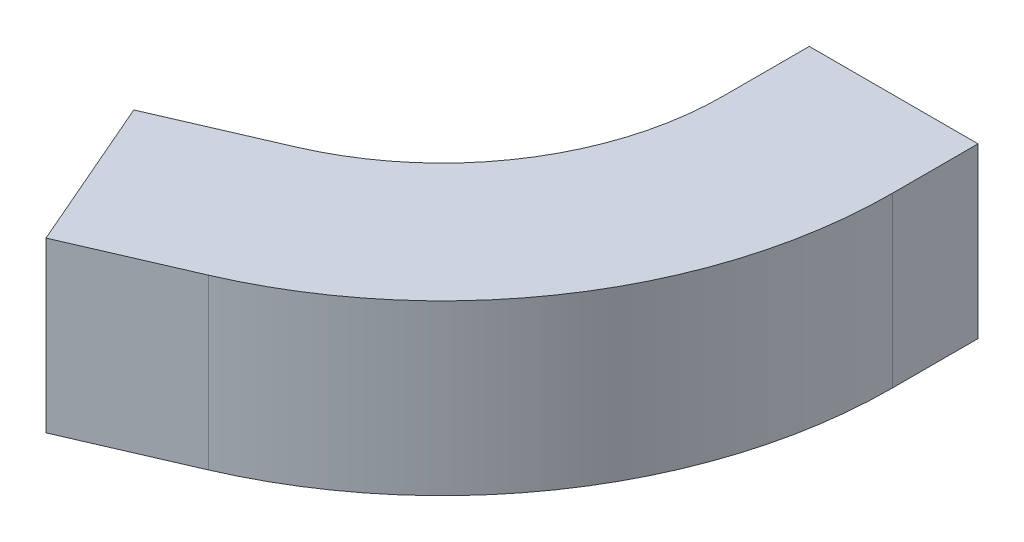
ISO-10303-21;
HEADER;
FILE_DESCRIPTION(('STEP AP214'),'2;1');
FILE_NAME('part.step','',(''),(''),'','','');
FILE_SCHEMA(('AUTOMOTIVE_DESIGN { 1 0 10303 214 1 1 1 1 }'));
ENDSEC;
DATA;
#1=APPLICATION_CONTEXT('core data for automotive mechanical design processes');
#2=APPLICATION_PROTOCOL_DEFINITION('international standard','automotive_design',2000,#1);
#3=PRODUCT_CONTEXT('',#1,'mechanical');
#4=PRODUCT('Part','Part','',(#3));
#5=PRODUCT_RELATED_PRODUCT_CATEGORY('part','',(#4));
#6=PRODUCT_DEFINITION_FORMATION('','',#4);
#7=PRODUCT_DEFINITION_CONTEXT('part definition',#1,'design');
#8=PRODUCT_DEFINITION('design','',#6,#7);
#9=PRODUCT_DEFINITION_SHAPE('','',#8);
#10=(LENGTH_UNIT() NAMED_UNIT(*) SI_UNIT(.MILLI.,.METRE.));
#11=(NAMED_UNIT(*) PLANE_ANGLE_UNIT() SI_UNIT($,.RADIAN.));
#12=(NAMED_UNIT(*) SI_UNIT($,.STERADIAN.) SOLID_ANGLE_UNIT());
#13=UNCERTAINTY_MEASURE_WITH_UNIT(LENGTH_MEASURE(1.E-05),#10,'distance_accuracy_value','');
#14=(GEOMETRIC_REPRESENTATION_CONTEXT(3) GLOBAL_UNCERTAINTY_ASSIGNED_CONTEXT((#13)) GLOBAL_UNIT_ASSIGNED_CONTEXT((#10,
#11,#12)) REPRESENTATION_CONTEXT('',''));
#15=CARTESIAN_POINT('',(0.,0.,0.));
#16=DIRECTION('',(0.,0.,1.));
#17=DIRECTION('',(1.,0.,0.));
#18=AXIS2_PLACEMENT_3D('',#15,#16,#17);
#19=CARTESIAN_POINT('',(-10.0670077006638,15.,4.35846945093989));
#20=DIRECTION('',(-0.917685296323042,0.,0.397308062984493));
#21=DIRECTION('',(0.397308062984493,0.,0.917685296323043));
#22=AXIS2_PLACEMENT_3D('',#19,#20,#21);
#23=PLANE('',#22);
#24=DIRECTION('',(-0.397308062984493,0.,-0.917685296323043));
#25=VECTOR('',#24,1.);
#26=CARTESIAN_POINT('',(-10.0670077006638,0.,4.35846945093989));
#27=LINE('',#26,#25);
#28=CARTESIAN_POINT('',(5.82531481871593,0.,41.0658813038616));
#29=VERTEX_POINT('',#28);
#30=CARTESIAN_POINT('',(-0.134306126051469,0.,27.300601859016));
#31=VERTEX_POINT('',#30);
#32=EDGE_CURVE('E142',#29,#31,#27,.T.);
#33=ORIENTED_EDGE('',*,*,#32,.F.);
#34=DIRECTION('',(0.,-1.,0.));
#35=VECTOR('',#34,1.);
#36=CARTESIAN_POINT('',(5.82531481871593,15.,41.0658813038616));
#37=LINE('',#36,#35);
#38=CARTESIAN_POINT('',(5.82531481871593,15.,41.0658813038616));
#39=VERTEX_POINT('',#38);
#40=EDGE_CURVE('E11',#39,#29,#37,.T.);
#41=ORIENTED_EDGE('',*,*,#40,.F.);
#42=DIRECTION('',(-0.397308062984493,0.,-0.917685296323043));
#43=VECTOR('',#42,1.);
#44=CARTESIAN_POINT('',(-10.0670077006638,15.,4.35846945093989));
#45=LINE('',#44,#43);
#46=CARTESIAN_POINT('',(-0.134306126051469,15.,27.300601859016));
#47=VERTEX_POINT('',#46);
#48=EDGE_CURVE('E169',#39,#47,#45,.T.);
#49=ORIENTED_EDGE('',*,*,#48,.T.);
#50=DIRECTION('',(0.,-1.,0.));
#51=VECTOR('',#50,1.);
#52=CARTESIAN_POINT('',(-0.134306126051469,15.,27.300601859016));
#53=LINE('',#52,#51);
#54=EDGE_CURVE('E62',#47,#31,#53,.T.);
#55=ORIENTED_EDGE('',*,*,#54,.T.);
#56=EDGE_LOOP('',(#33,#41,#49,#55));
#57=FACE_BOUND('',#56,.T.);
#58=ADVANCED_FACE('F45',(#57),#23,.T.);
#59=CARTESIAN_POINT('',(15.8923225193797,15.,36.7074118529217));
#60=DIRECTION('',(0.397308062984493,0.,0.917685296323042));
#61=DIRECTION('',(0.917685296323043,0.,-0.397308062984493));
#62=AXIS2_PLACEMENT_3D('',#59,#60,#61);
#63=PLANE('',#62);
#64=DIRECTION('',(-0.917685296323043,0.,0.397308062984493));
#65=VECTOR('',#64,1.);
#66=CARTESIAN_POINT('',(15.8923225193797,0.,36.7074118529217));
#67=LINE('',#66,#65);
#68=CARTESIAN_POINT('',(15.8923225193797,0.,36.7074118529217));
#69=VERTEX_POINT('',#68);
#70=EDGE_CURVE('E145',#69,#29,#67,.T.);
#71=ORIENTED_EDGE('',*,*,#70,.F.);
#72=DIRECTION('',(0.,-1.,0.));
#73=VECTOR('',#72,1.);
#74=CARTESIAN_POINT('',(15.8923225193797,15.,36.7074118529217));
#75=LINE('',#74,#73);
#76=CARTESIAN_POINT('',(15.8923225193797,15.,36.7074118529217));
#77=VERTEX_POINT('',#76);
#78=EDGE_CURVE('E54',#77,#69,#75,.T.);
#79=ORIENTED_EDGE('',*,*,#78,.F.);
#80=DIRECTION('',(-0.917685296323043,0.,0.397308062984493));
#81=VECTOR('',#80,1.);
#82=CARTESIAN_POINT('',(15.8923225193797,15.,36.7074118529217));
#83=LINE('',#82,#81);
#84=EDGE_CURVE('E197',#77,#39,#83,.T.);
#85=ORIENTED_EDGE('',*,*,#84,.T.);
#86=ORIENTED_EDGE('',*,*,#40,.T.);
#87=EDGE_LOOP('',(#71,#79,#85,#86));
#88=FACE_BOUND('',#87,.T.);
#89=ADVANCED_FACE('F196',(#88),#63,.T.);
#90=CARTESIAN_POINT('',(0.,15.,0.));
#91=DIRECTION('',(0.,-1.,0.));
#92=DIRECTION('',(0.,0.,-1.));
#93=AXIS2_PLACEMENT_3D('',#90,#91,#92);
#94=CYLINDRICAL_SURFACE('',#93,40.);
#95=CARTESIAN_POINT('',(0.,0.,0.));
#96=DIRECTION('',(0.,1.,0.));
#97=DIRECTION('',(0.,0.,1.));
#98=AXIS2_PLACEMENT_3D('',#95,#96,#97);
#99=CIRCLE('',#98,40.);
#100=CARTESIAN_POINT('',(40.,0.,0.));
#101=VERTEX_POINT('',#100);
#102=EDGE_CURVE('E149',#69,#101,#99,.T.);
#103=ORIENTED_EDGE('',*,*,#102,.T.);
#104=DIRECTION('',(0.,-1.,0.));
#105=VECTOR('',#104,1.);
#106=CARTESIAN_POINT('',(40.,15.,0.));
#107=LINE('',#106,#105);
#108=CARTESIAN_POINT('',(40.,15.,0.));
#109=VERTEX_POINT('',#108);
#110=EDGE_CURVE('E179',#109,#101,#107,.T.);
#111=ORIENTED_EDGE('',*,*,#110,.F.);
#112=CARTESIAN_POINT('',(0.,15.,0.));
#113=DIRECTION('',(0.,1.,0.));
#114=DIRECTION('',(0.,0.,1.));
#115=AXIS2_PLACEMENT_3D('',#112,#113,#114);
#116=CIRCLE('',#115,40.);
#117=EDGE_CURVE('E188',#77,#109,#116,.T.);
#118=ORIENTED_EDGE('',*,*,#117,.F.);
#119=ORIENTED_EDGE('',*,*,#78,.T.);
#120=EDGE_LOOP('',(#103,#111,#118,#119));
#121=FACE_BOUND('',#120,.T.);
#122=ADVANCED_FACE('F186',(#121),#94,.T.);
#123=CARTESIAN_POINT('',(40.,15.,0.));
#124=DIRECTION('',(-1.,0.,0.));
#125=DIRECTION('',(0.,0.,1.));
#126=AXIS2_PLACEMENT_3D('',#123,#124,#125);
#127=PLANE('',#126);
#128=DIRECTION('',(0.,0.,-1.));
#129=VECTOR('',#128,1.);
#130=CARTESIAN_POINT('',(40.,0.,0.));
#131=LINE('',#130,#129);
#132=CARTESIAN_POINT('',(40.,0.,-7.62));
#133=VERTEX_POINT('',#132);
#134=EDGE_CURVE('E152',#101,#133,#131,.T.);
#135=ORIENTED_EDGE('',*,*,#134,.T.);
#136=DIRECTION('',(0.,-1.,0.));
#137=VECTOR('',#136,1.);
#138=CARTESIAN_POINT('',(40.,15.,-7.62));
#139=LINE('',#138,#137);
#140=CARTESIAN_POINT('',(40.,15.,-7.62));
#141=VERTEX_POINT('',#140);
#142=EDGE_CURVE('E176',#141,#133,#139,.T.);
#143=ORIENTED_EDGE('',*,*,#142,.F.);
#144=DIRECTION('',(0.,0.,-1.));
#145=VECTOR('',#144,1.);
#146=CARTESIAN_POINT('',(40.,15.,0.));
#147=LINE('',#146,#145);
#148=EDGE_CURVE('E328',#109,#141,#147,.T.);
#149=ORIENTED_EDGE('',*,*,#148,.F.);
#150=ORIENTED_EDGE('',*,*,#110,.T.);
#151=EDGE_LOOP('',(#135,#143,#149,#150));
#152=FACE_BOUND('',#151,.T.);
#153=ADVANCED_FACE('F215',(#152),#127,.F.);
#154=CARTESIAN_POINT('',(0.,15.,-7.62));
#155=DIRECTION('',(0.,0.,-1.));
#156=DIRECTION('',(-1.,0.,0.));
#157=AXIS2_PLACEMENT_3D('',#154,#155,#156);
#158=PLANE('',#157);
#159=DIRECTION('',(1.,0.,0.));
#160=VECTOR('',#159,1.);
#161=CARTESIAN_POINT('',(0.,0.,-7.62));
#162=LINE('',#161,#160);
#163=CARTESIAN_POINT('',(25.,0.,-7.62));
#164=VERTEX_POINT('',#163);
#165=EDGE_CURVE('E156',#164,#133,#162,.T.);
#166=ORIENTED_EDGE('',*,*,#165,.F.);
#167=DIRECTION('',(0.,-1.,0.));
#168=VECTOR('',#167,1.);
#169=CARTESIAN_POINT('',(25.,15.,-7.62));
#170=LINE('',#169,#168);
#171=CARTESIAN_POINT('',(25.,15.,-7.62));
#172=VERTEX_POINT('',#171);
#173=EDGE_CURVE('E122',#172,#164,#170,.T.);
#174=ORIENTED_EDGE('',*,*,#173,.F.);
#175=DIRECTION('',(1.,0.,0.));
#176=VECTOR('',#175,1.);
#177=CARTESIAN_POINT('',(0.,15.,-7.62));
#178=LINE('',#177,#176);
#179=EDGE_CURVE('E131',#172,#141,#178,.T.);
#180=ORIENTED_EDGE('',*,*,#179,.T.);
#181=ORIENTED_EDGE('',*,*,#142,.T.);
#182=EDGE_LOOP('',(#166,#174,#180,#181));
#183=FACE_BOUND('',#182,.T.);
#184=ADVANCED_FACE('F220',(#183),#158,.T.);
#185=CARTESIAN_POINT('',(25.,15.,0.));
#186=DIRECTION('',(-1.,0.,0.));
#187=DIRECTION('',(0.,0.,1.));
#188=AXIS2_PLACEMENT_3D('',#185,#186,#187);
#189=PLANE('',#188);
#190=DIRECTION('',(0.,0.,-1.));
#191=VECTOR('',#190,1.);
#192=CARTESIAN_POINT('',(25.,0.,0.));
#193=LINE('',#192,#191);
#194=CARTESIAN_POINT('',(25.,0.,0.));
#195=VERTEX_POINT('',#194);
#196=EDGE_CURVE('E117',#195,#164,#193,.T.);
#197=ORIENTED_EDGE('',*,*,#196,.F.);
#198=DIRECTION('',(0.,-1.,0.));
#199=VECTOR('',#198,1.);
#200=CARTESIAN_POINT('',(25.,15.,0.));
#201=LINE('',#200,#199);
#202=CARTESIAN_POINT('',(25.,15.,0.));
#203=VERTEX_POINT('',#202);
#204=EDGE_CURVE('E112',#203,#195,#201,.T.);
#205=ORIENTED_EDGE('',*,*,#204,.F.);
#206=DIRECTION('',(0.,0.,-1.));
#207=VECTOR('',#206,1.);
#208=CARTESIAN_POINT('',(25.,15.,0.));
#209=LINE('',#208,#207);
#210=EDGE_CURVE('E115',#203,#172,#209,.T.);
#211=ORIENTED_EDGE('',*,*,#210,.T.);
#212=ORIENTED_EDGE('',*,*,#173,.T.);
#213=EDGE_LOOP('',(#197,#205,#211,#212));
#214=FACE_BOUND('',#213,.T.);
#215=ADVANCED_FACE('F114',(#214),#189,.T.);
#216=CARTESIAN_POINT('',(0.,15.,0.));
#217=DIRECTION('',(0.,-1.,0.));
#218=DIRECTION('',(0.,0.,-1.));
#219=AXIS2_PLACEMENT_3D('',#216,#217,#218);
#220=CYLINDRICAL_SURFACE('',#219,25.);
#221=CARTESIAN_POINT('',(0.,0.,0.));
#222=DIRECTION('',(0.,1.,0.));
#223=DIRECTION('',(0.,0.,1.));
#224=AXIS2_PLACEMENT_3D('',#221,#222,#223);
#225=CIRCLE('',#224,25.);
#226=CARTESIAN_POINT('',(9.93270157461231,0.,22.9421324080761));
#227=VERTEX_POINT('',#226);
#228=EDGE_CURVE('E162',#227,#195,#225,.T.);
#229=ORIENTED_EDGE('',*,*,#228,.F.);
#230=DIRECTION('',(0.,-1.,0.));
#231=VECTOR('',#230,1.);
#232=CARTESIAN_POINT('',(9.93270157461231,15.,22.9421324080761));
#233=LINE('',#232,#231);
#234=CARTESIAN_POINT('',(9.93270157461231,15.,22.9421324080761));
#235=VERTEX_POINT('',#234);
#236=EDGE_CURVE('E87',#235,#227,#233,.T.);
#237=ORIENTED_EDGE('',*,*,#236,.F.);
#238=CARTESIAN_POINT('',(0.,15.,0.));
#239=DIRECTION('',(0.,1.,0.));
#240=DIRECTION('',(0.,0.,1.));
#241=AXIS2_PLACEMENT_3D('',#238,#239,#240);
#242=CIRCLE('',#241,25.);
#243=EDGE_CURVE('E129',#235,#203,#242,.T.);
#244=ORIENTED_EDGE('',*,*,#243,.T.);
#245=ORIENTED_EDGE('',*,*,#204,.T.);
#246=EDGE_LOOP('',(#229,#237,#244,#245));
#247=FACE_BOUND('',#246,.T.);
#248=ADVANCED_FACE('F134',(#247),#220,.F.);
#249=CARTESIAN_POINT('',(9.93270157461232,15.,22.9421324080761));
#250=DIRECTION('',(-0.397308062984493,0.,-0.917685296323042));
#251=DIRECTION('',(-0.917685296323043,0.,0.397308062984493));
#252=AXIS2_PLACEMENT_3D('',#249,#250,#251);
#253=PLANE('',#252);
#254=DIRECTION('',(0.917685296323043,0.,-0.397308062984493));
#255=VECTOR('',#254,1.);
#256=CARTESIAN_POINT('',(9.93270157461232,0.,22.9421324080761));
#257=LINE('',#256,#255);
#258=EDGE_CURVE('E165',#31,#227,#257,.T.);
#259=ORIENTED_EDGE('',*,*,#258,.F.);
#260=ORIENTED_EDGE('',*,*,#54,.F.);
#261=DIRECTION('',(0.917685296323043,0.,-0.397308062984493));
#262=VECTOR('',#261,1.);
#263=CARTESIAN_POINT('',(9.93270157461232,15.,22.9421324080761));
#264=LINE('',#263,#262);
#265=EDGE_CURVE('E136',#47,#235,#264,.T.);
#266=ORIENTED_EDGE('',*,*,#265,.T.);
#267=ORIENTED_EDGE('',*,*,#236,.T.);
#268=EDGE_LOOP('',(#259,#260,#266,#267));
#269=FACE_BOUND('',#268,.T.);
#270=ADVANCED_FACE('F198',(#269),#253,.T.);
#271=CARTESIAN_POINT('',(0.,15.,0.));
#272=DIRECTION('',(0.,1.,0.));
#273=DIRECTION('',(0.,0.,1.));
#274=AXIS2_PLACEMENT_3D('',#271,#272,#273);
#275=PLANE('',#274);
#276=ORIENTED_EDGE('',*,*,#48,.F.);
#277=ORIENTED_EDGE('',*,*,#84,.F.);
#278=ORIENTED_EDGE('',*,*,#117,.T.);
#279=ORIENTED_EDGE('',*,*,#148,.T.);
#280=ORIENTED_EDGE('',*,*,#179,.F.);
#281=ORIENTED_EDGE('',*,*,#210,.F.);
#282=ORIENTED_EDGE('',*,*,#243,.F.);
#283=ORIENTED_EDGE('',*,*,#265,.F.);
#284=EDGE_LOOP('',(#276,#277,#278,#279,#280,#281,#282,#283));
#285=FACE_BOUND('',#284,.T.);
#286=ADVANCED_FACE('F127',(#285),#275,.T.);
#287=CARTESIAN_POINT('',(0.,0.,0.));
#288=DIRECTION('',(0.,1.,0.));
#289=DIRECTION('',(0.,0.,1.));
#290=AXIS2_PLACEMENT_3D('',#287,#288,#289);
#291=PLANE('',#290);
#292=ORIENTED_EDGE('',*,*,#32,.T.);
#293=ORIENTED_EDGE('',*,*,#258,.T.);
#294=ORIENTED_EDGE('',*,*,#228,.T.);
#295=ORIENTED_EDGE('',*,*,#196,.T.);
#296=ORIENTED_EDGE('',*,*,#165,.T.);
#297=ORIENTED_EDGE('',*,*,#134,.F.);
#298=ORIENTED_EDGE('',*,*,#102,.F.);
#299=ORIENTED_EDGE('',*,*,#70,.T.);
#300=EDGE_LOOP('',(#292,#293,#294,#295,#296,#297,#298,#299));
#301=FACE_BOUND('',#300,.T.);
#302=ADVANCED_FACE('F195',(#301),#291,.F.);
#303=CLOSED_SHELL('',(#58,#89,#122,#153,#184,#215,#248,#270,#286,#302));
#304=MANIFOLD_SOLID_BREP('B2',#303);
#305=ADVANCED_BREP_SHAPE_REPRESENTATION('',(#18,#304),#14);
#306=SHAPE_DEFINITION_REPRESENTATION(#9,#305);
ENDSEC;
END-ISO-10303-21;
